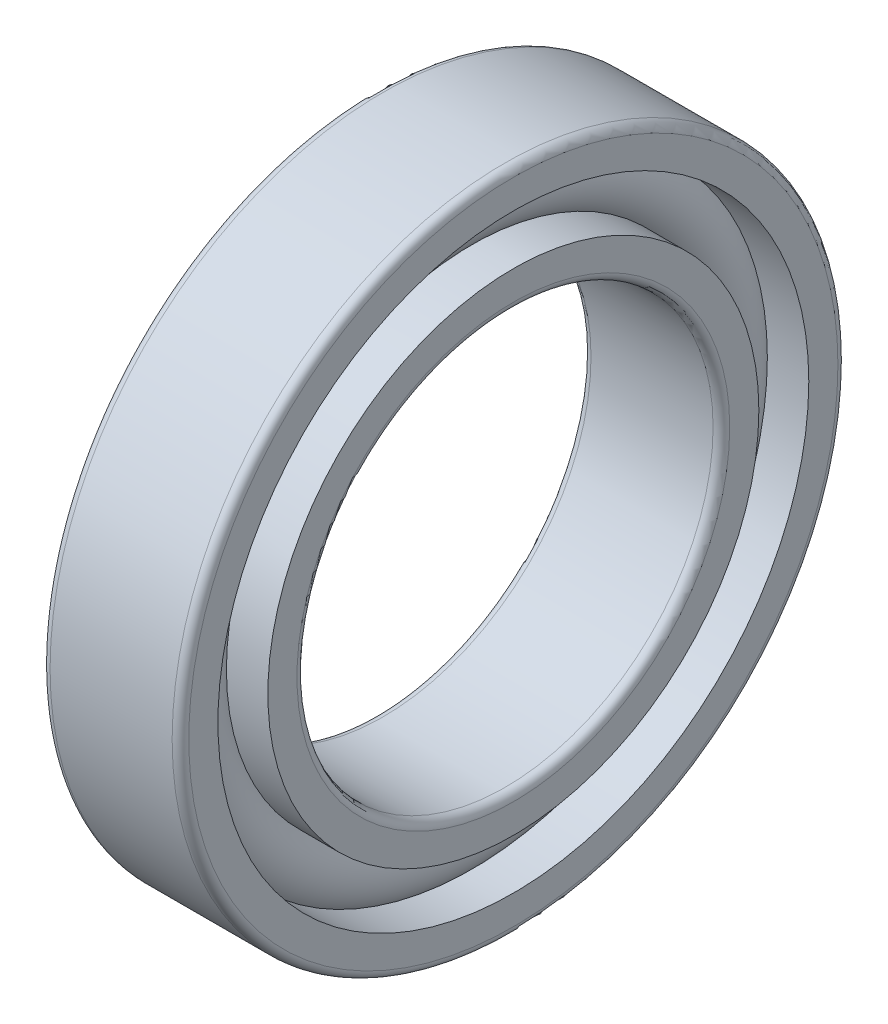
ISO-10303-21;
HEADER;
FILE_DESCRIPTION(('STEP AP214'),'2;1');
FILE_NAME('part.step','',(''),(''),'','','');
FILE_SCHEMA(('AUTOMOTIVE_DESIGN { 1 0 10303 214 1 1 1 1 }'));
ENDSEC;
DATA;
#1=APPLICATION_CONTEXT('core data for automotive mechanical design processes');
#2=APPLICATION_PROTOCOL_DEFINITION('international standard','automotive_design',2000,#1);
#3=PRODUCT_CONTEXT('',#1,'mechanical');
#4=PRODUCT('Part','Part','',(#3));
#5=PRODUCT_RELATED_PRODUCT_CATEGORY('part','',(#4));
#6=PRODUCT_DEFINITION_FORMATION('','',#4);
#7=PRODUCT_DEFINITION_CONTEXT('part definition',#1,'design');
#8=PRODUCT_DEFINITION('design','',#6,#7);
#9=PRODUCT_DEFINITION_SHAPE('','',#8);
#10=(LENGTH_UNIT() NAMED_UNIT(*) SI_UNIT(.MILLI.,.METRE.));
#11=(NAMED_UNIT(*) PLANE_ANGLE_UNIT() SI_UNIT($,.RADIAN.));
#12=(NAMED_UNIT(*) SI_UNIT($,.STERADIAN.) SOLID_ANGLE_UNIT());
#13=UNCERTAINTY_MEASURE_WITH_UNIT(LENGTH_MEASURE(1.E-05),#10,'distance_accuracy_value','');
#14=(GEOMETRIC_REPRESENTATION_CONTEXT(3) GLOBAL_UNCERTAINTY_ASSIGNED_CONTEXT((#13)) GLOBAL_UNIT_ASSIGNED_CONTEXT((#10,
#11,#12)) REPRESENTATION_CONTEXT('',''));
#15=CARTESIAN_POINT('',(0.,0.,0.));
#16=DIRECTION('',(0.,0.,1.));
#17=DIRECTION('',(1.,0.,0.));
#18=AXIS2_PLACEMENT_3D('',#15,#16,#17);
#19=CARTESIAN_POINT('',(0.,0.,0.));
#20=DIRECTION('',(-1.,0.,0.));
#21=DIRECTION('',(0.,0.,1.));
#22=AXIS2_PLACEMENT_3D('',#19,#20,#21);
#23=TOROIDAL_SURFACE('',#22,9.75,1.35);
#24=CARTESIAN_POINT('',(1.0062305898749,0.,0.));
#25=DIRECTION('',(-1.,0.,0.));
#26=DIRECTION('',(0.,0.,1.));
#27=AXIS2_PLACEMENT_3D('',#24,#25,#26);
#28=CIRCLE('',#27,10.65);
#29=CARTESIAN_POINT('',(1.0062305898749,0.,10.65));
#30=VERTEX_POINT('',#29);
#31=EDGE_CURVE('E35',#30,#30,#28,.F.);
#32=ORIENTED_EDGE('',*,*,#31,.T.);
#33=EDGE_LOOP('',(#32));
#34=FACE_BOUND('',#33,.T.);
#35=CARTESIAN_POINT('',(1.0062305898749,0.,0.));
#36=DIRECTION('',(-1.,0.,0.));
#37=DIRECTION('',(0.,0.,1.));
#38=AXIS2_PLACEMENT_3D('',#35,#36,#37);
#39=CIRCLE('',#38,8.85);
#40=CARTESIAN_POINT('',(1.0062305898749,0.,8.85));
#41=VERTEX_POINT('',#40);
#42=EDGE_CURVE('E10',#41,#41,#39,.T.);
#43=ORIENTED_EDGE('',*,*,#42,.T.);
#44=EDGE_LOOP('',(#43));
#45=FACE_BOUND('',#44,.T.);
#46=ADVANCED_FACE('F31',(#34,#45),#23,.T.);
#47=CARTESIAN_POINT('',(-20.6375,0.,0.));
#48=DIRECTION('',(1.,0.,0.));
#49=DIRECTION('',(0.,0.,-1.));
#50=AXIS2_PLACEMENT_3D('',#47,#48,#49);
#51=CYLINDRICAL_SURFACE('',#50,8.85);
#52=CARTESIAN_POINT('',(2.5,0.,0.));
#53=DIRECTION('',(1.,0.,0.));
#54=DIRECTION('',(0.,0.,-1.));
#55=AXIS2_PLACEMENT_3D('',#52,#53,#54);
#56=CIRCLE('',#55,8.85);
#57=CARTESIAN_POINT('',(2.5,0.,-8.85));
#58=VERTEX_POINT('',#57);
#59=EDGE_CURVE('E44',#58,#58,#56,.T.);
#60=ORIENTED_EDGE('',*,*,#59,.F.);
#61=EDGE_LOOP('',(#60));
#62=FACE_BOUND('',#61,.T.);
#63=ORIENTED_EDGE('',*,*,#42,.F.);
#64=EDGE_LOOP('',(#63));
#65=FACE_BOUND('',#64,.T.);
#66=ADVANCED_FACE('F83',(#62,#65),#51,.T.);
#67=CARTESIAN_POINT('',(-20.6375,0.,0.));
#68=DIRECTION('',(1.,0.,0.));
#69=DIRECTION('',(0.,0.,-1.));
#70=AXIS2_PLACEMENT_3D('',#67,#68,#69);
#71=CYLINDRICAL_SURFACE('',#70,8.85);
#72=CARTESIAN_POINT('',(-2.5,0.,0.));
#73=DIRECTION('',(1.,0.,0.));
#74=DIRECTION('',(0.,0.,-1.));
#75=AXIS2_PLACEMENT_3D('',#72,#73,#74);
#76=CIRCLE('',#75,8.85);
#77=CARTESIAN_POINT('',(-2.5,0.,-8.85));
#78=VERTEX_POINT('',#77);
#79=EDGE_CURVE('E53',#78,#78,#76,.T.);
#80=ORIENTED_EDGE('',*,*,#79,.T.);
#81=EDGE_LOOP('',(#80));
#82=FACE_BOUND('',#81,.T.);
#83=CARTESIAN_POINT('',(-1.0062305898749,0.,0.));
#84=DIRECTION('',(1.,0.,0.));
#85=DIRECTION('',(0.,0.,-1.));
#86=AXIS2_PLACEMENT_3D('',#83,#84,#85);
#87=CIRCLE('',#86,8.85);
#88=CARTESIAN_POINT('',(-1.0062305898749,0.,-8.85));
#89=VERTEX_POINT('',#88);
#90=EDGE_CURVE('E39',#89,#89,#87,.T.);
#91=ORIENTED_EDGE('',*,*,#90,.F.);
#92=EDGE_LOOP('',(#91));
#93=FACE_BOUND('',#92,.T.);
#94=ADVANCED_FACE('F86',(#82,#93),#71,.T.);
#95=CARTESIAN_POINT('',(2.5,7.8,0.));
#96=DIRECTION('',(1.,0.,0.));
#97=DIRECTION('',(0.,0.,-1.));
#98=AXIS2_PLACEMENT_3D('',#95,#96,#97);
#99=PLANE('',#98);
#100=ORIENTED_EDGE('',*,*,#59,.T.);
#101=EDGE_LOOP('',(#100));
#102=FACE_BOUND('',#101,.T.);
#103=CARTESIAN_POINT('',(2.5,0.,0.));
#104=DIRECTION('',(1.,0.,0.));
#105=DIRECTION('',(0.,0.,-1.));
#106=AXIS2_PLACEMENT_3D('',#103,#104,#105);
#107=CIRCLE('',#106,7.8);
#108=CARTESIAN_POINT('',(2.5,0.,-7.8));
#109=VERTEX_POINT('',#108);
#110=EDGE_CURVE('E75',#109,#109,#107,.T.);
#111=ORIENTED_EDGE('',*,*,#110,.F.);
#112=EDGE_LOOP('',(#111));
#113=FACE_BOUND('',#112,.T.);
#114=ADVANCED_FACE('F80',(#102,#113),#99,.T.);
#115=CARTESIAN_POINT('',(2.2,0.,0.));
#116=DIRECTION('',(1.,0.,0.));
#117=DIRECTION('',(0.,0.,-1.));
#118=AXIS2_PLACEMENT_3D('',#115,#116,#117);
#119=TOROIDAL_SURFACE('',#118,7.8,0.3);
#120=ORIENTED_EDGE('',*,*,#110,.T.);
#121=EDGE_LOOP('',(#120));
#122=FACE_BOUND('',#121,.T.);
#123=CARTESIAN_POINT('',(2.2,0.,0.));
#124=DIRECTION('',(1.,0.,0.));
#125=DIRECTION('',(0.,0.,-1.));
#126=AXIS2_PLACEMENT_3D('',#123,#124,#125);
#127=CIRCLE('',#126,7.5);
#128=CARTESIAN_POINT('',(2.2,0.,-7.5));
#129=VERTEX_POINT('',#128);
#130=EDGE_CURVE('E72',#129,#129,#127,.T.);
#131=ORIENTED_EDGE('',*,*,#130,.F.);
#132=EDGE_LOOP('',(#131));
#133=FACE_BOUND('',#132,.T.);
#134=ADVANCED_FACE('F97',(#122,#133),#119,.T.);
#135=CARTESIAN_POINT('',(-20.6375,0.,0.));
#136=DIRECTION('',(1.,0.,0.));
#137=DIRECTION('',(0.,0.,-1.));
#138=AXIS2_PLACEMENT_3D('',#135,#136,#137);
#139=CYLINDRICAL_SURFACE('',#138,7.5);
#140=ORIENTED_EDGE('',*,*,#130,.T.);
#141=EDGE_LOOP('',(#140));
#142=FACE_BOUND('',#141,.T.);
#143=CARTESIAN_POINT('',(-2.2,0.,0.));
#144=DIRECTION('',(1.,0.,0.));
#145=DIRECTION('',(0.,0.,-1.));
#146=AXIS2_PLACEMENT_3D('',#143,#144,#145);
#147=CIRCLE('',#146,7.5);
#148=CARTESIAN_POINT('',(-2.2,0.,-7.5));
#149=VERTEX_POINT('',#148);
#150=EDGE_CURVE('E69',#149,#149,#147,.T.);
#151=ORIENTED_EDGE('',*,*,#150,.F.);
#152=EDGE_LOOP('',(#151));
#153=FACE_BOUND('',#152,.T.);
#154=ADVANCED_FACE('F100',(#142,#153),#139,.F.);
#155=CARTESIAN_POINT('',(-2.2,0.,0.));
#156=DIRECTION('',(1.,0.,0.));
#157=DIRECTION('',(0.,0.,-1.));
#158=AXIS2_PLACEMENT_3D('',#155,#156,#157);
#159=TOROIDAL_SURFACE('',#158,7.8,0.3);
#160=ORIENTED_EDGE('',*,*,#150,.T.);
#161=EDGE_LOOP('',(#160));
#162=FACE_BOUND('',#161,.T.);
#163=CARTESIAN_POINT('',(-2.5,0.,0.));
#164=DIRECTION('',(1.,0.,0.));
#165=DIRECTION('',(0.,0.,-1.));
#166=AXIS2_PLACEMENT_3D('',#163,#164,#165);
#167=CIRCLE('',#166,7.8);
#168=CARTESIAN_POINT('',(-2.5,0.,-7.8));
#169=VERTEX_POINT('',#168);
#170=EDGE_CURVE('E66',#169,#169,#167,.T.);
#171=ORIENTED_EDGE('',*,*,#170,.F.);
#172=EDGE_LOOP('',(#171));
#173=FACE_BOUND('',#172,.T.);
#174=ADVANCED_FACE('F104',(#162,#173),#159,.T.);
#175=CARTESIAN_POINT('',(-2.5,8.85,0.));
#176=DIRECTION('',(-1.,0.,0.));
#177=DIRECTION('',(0.,0.,1.));
#178=AXIS2_PLACEMENT_3D('',#175,#176,#177);
#179=PLANE('',#178);
#180=ORIENTED_EDGE('',*,*,#170,.T.);
#181=EDGE_LOOP('',(#180));
#182=FACE_BOUND('',#181,.T.);
#183=ORIENTED_EDGE('',*,*,#79,.F.);
#184=EDGE_LOOP('',(#183));
#185=FACE_BOUND('',#184,.T.);
#186=ADVANCED_FACE('F108',(#182,#185),#179,.T.);
#187=CARTESIAN_POINT('',(-1.0062305898749,0.,0.));
#188=DIRECTION('',(1.,0.,0.));
#189=DIRECTION('',(0.,0.,-1.));
#190=AXIS2_PLACEMENT_3D('',#187,#188,#189);
#191=CIRCLE('',#190,10.65);
#192=CARTESIAN_POINT('',(-1.0062305898749,0.,-10.65));
#193=VERTEX_POINT('',#192);
#194=EDGE_CURVE('E47',#193,#193,#191,.F.);
#195=ORIENTED_EDGE('',*,*,#194,.T.);
#196=EDGE_LOOP('',(#195));
#197=FACE_BOUND('',#196,.T.);
#198=ORIENTED_EDGE('',*,*,#90,.T.);
#199=EDGE_LOOP('',(#198));
#200=FACE_BOUND('',#199,.T.);
#201=ADVANCED_FACE('F33',(#197,#200),#23,.T.);
#202=CARTESIAN_POINT('',(-20.6375,0.,0.));
#203=DIRECTION('',(1.,0.,0.));
#204=DIRECTION('',(0.,0.,-1.));
#205=AXIS2_PLACEMENT_3D('',#202,#203,#204);
#206=CYLINDRICAL_SURFACE('',#205,10.65);
#207=CARTESIAN_POINT('',(2.5,0.,0.));
#208=DIRECTION('',(1.,0.,0.));
#209=DIRECTION('',(0.,0.,-1.));
#210=AXIS2_PLACEMENT_3D('',#207,#208,#209);
#211=CIRCLE('',#210,10.65);
#212=CARTESIAN_POINT('',(2.5,0.,-10.65));
#213=VERTEX_POINT('',#212);
#214=EDGE_CURVE('E49',#213,#213,#211,.T.);
#215=ORIENTED_EDGE('',*,*,#214,.T.);
#216=EDGE_LOOP('',(#215));
#217=FACE_BOUND('',#216,.T.);
#218=ORIENTED_EDGE('',*,*,#31,.F.);
#219=EDGE_LOOP('',(#218));
#220=FACE_BOUND('',#219,.T.);
#221=ADVANCED_FACE('F113',(#217,#220),#206,.F.);
#222=CARTESIAN_POINT('',(-20.6375,0.,0.));
#223=DIRECTION('',(1.,0.,0.));
#224=DIRECTION('',(0.,0.,-1.));
#225=AXIS2_PLACEMENT_3D('',#222,#223,#224);
#226=CYLINDRICAL_SURFACE('',#225,10.65);
#227=CARTESIAN_POINT('',(-2.5,0.,0.));
#228=DIRECTION('',(1.,0.,0.));
#229=DIRECTION('',(0.,0.,-1.));
#230=AXIS2_PLACEMENT_3D('',#227,#228,#229);
#231=CIRCLE('',#230,10.65);
#232=CARTESIAN_POINT('',(-2.5,0.,-10.65));
#233=VERTEX_POINT('',#232);
#234=EDGE_CURVE('E144',#233,#233,#231,.T.);
#235=ORIENTED_EDGE('',*,*,#234,.F.);
#236=EDGE_LOOP('',(#235));
#237=FACE_BOUND('',#236,.T.);
#238=ORIENTED_EDGE('',*,*,#194,.F.);
#239=EDGE_LOOP('',(#238));
#240=FACE_BOUND('',#239,.T.);
#241=ADVANCED_FACE('F116',(#237,#240),#226,.F.);
#242=CARTESIAN_POINT('',(2.5,11.7,0.));
#243=DIRECTION('',(1.,0.,0.));
#244=DIRECTION('',(0.,0.,-1.));
#245=AXIS2_PLACEMENT_3D('',#242,#243,#244);
#246=PLANE('',#245);
#247=CARTESIAN_POINT('',(2.5,0.,0.));
#248=DIRECTION('',(1.,0.,0.));
#249=DIRECTION('',(0.,0.,-1.));
#250=AXIS2_PLACEMENT_3D('',#247,#248,#249);
#251=CIRCLE('',#250,11.7);
#252=CARTESIAN_POINT('',(2.5,0.,-11.7));
#253=VERTEX_POINT('',#252);
#254=EDGE_CURVE('E55',#253,#253,#251,.T.);
#255=ORIENTED_EDGE('',*,*,#254,.T.);
#256=EDGE_LOOP('',(#255));
#257=FACE_BOUND('',#256,.T.);
#258=ORIENTED_EDGE('',*,*,#214,.F.);
#259=EDGE_LOOP('',(#258));
#260=FACE_BOUND('',#259,.T.);
#261=ADVANCED_FACE('F117',(#257,#260),#246,.T.);
#262=CARTESIAN_POINT('',(2.2,0.,0.));
#263=DIRECTION('',(1.,0.,0.));
#264=DIRECTION('',(0.,0.,-1.));
#265=AXIS2_PLACEMENT_3D('',#262,#263,#264);
#266=TOROIDAL_SURFACE('',#265,11.7,0.3);
#267=CARTESIAN_POINT('',(2.2,0.,0.));
#268=DIRECTION('',(1.,0.,0.));
#269=DIRECTION('',(0.,0.,-1.));
#270=AXIS2_PLACEMENT_3D('',#267,#268,#269);
#271=CIRCLE('',#270,12.);
#272=CARTESIAN_POINT('',(2.2,0.,-12.));
#273=VERTEX_POINT('',#272);
#274=EDGE_CURVE('E60',#273,#273,#271,.T.);
#275=ORIENTED_EDGE('',*,*,#274,.T.);
#276=EDGE_LOOP('',(#275));
#277=FACE_BOUND('',#276,.T.);
#278=ORIENTED_EDGE('',*,*,#254,.F.);
#279=EDGE_LOOP('',(#278));
#280=FACE_BOUND('',#279,.T.);
#281=ADVANCED_FACE('F120',(#277,#280),#266,.T.);
#282=CARTESIAN_POINT('',(-20.6375,0.,0.));
#283=DIRECTION('',(1.,0.,0.));
#284=DIRECTION('',(0.,0.,-1.));
#285=AXIS2_PLACEMENT_3D('',#282,#283,#284);
#286=CYLINDRICAL_SURFACE('',#285,12.);
#287=CARTESIAN_POINT('',(-2.2,0.,0.));
#288=DIRECTION('',(1.,0.,0.));
#289=DIRECTION('',(0.,0.,-1.));
#290=AXIS2_PLACEMENT_3D('',#287,#288,#289);
#291=CIRCLE('',#290,12.);
#292=CARTESIAN_POINT('',(-2.2,0.,-12.));
#293=VERTEX_POINT('',#292);
#294=EDGE_CURVE('E148',#293,#293,#291,.T.);
#295=ORIENTED_EDGE('',*,*,#294,.T.);
#296=EDGE_LOOP('',(#295));
#297=FACE_BOUND('',#296,.T.);
#298=ORIENTED_EDGE('',*,*,#274,.F.);
#299=EDGE_LOOP('',(#298));
#300=FACE_BOUND('',#299,.T.);
#301=ADVANCED_FACE('F124',(#297,#300),#286,.T.);
#302=CARTESIAN_POINT('',(-2.2,0.,0.));
#303=DIRECTION('',(1.,0.,0.));
#304=DIRECTION('',(0.,0.,-1.));
#305=AXIS2_PLACEMENT_3D('',#302,#303,#304);
#306=TOROIDAL_SURFACE('',#305,11.7,0.3);
#307=CARTESIAN_POINT('',(-2.5,0.,0.));
#308=DIRECTION('',(1.,0.,0.));
#309=DIRECTION('',(0.,0.,-1.));
#310=AXIS2_PLACEMENT_3D('',#307,#308,#309);
#311=CIRCLE('',#310,11.7);
#312=CARTESIAN_POINT('',(-2.5,0.,-11.7));
#313=VERTEX_POINT('',#312);
#314=EDGE_CURVE('E145',#313,#313,#311,.T.);
#315=ORIENTED_EDGE('',*,*,#314,.T.);
#316=EDGE_LOOP('',(#315));
#317=FACE_BOUND('',#316,.T.);
#318=ORIENTED_EDGE('',*,*,#294,.F.);
#319=EDGE_LOOP('',(#318));
#320=FACE_BOUND('',#319,.T.);
#321=ADVANCED_FACE('F128',(#317,#320),#306,.T.);
#322=CARTESIAN_POINT('',(-2.5,10.65,0.));
#323=DIRECTION('',(-1.,0.,0.));
#324=DIRECTION('',(0.,0.,1.));
#325=AXIS2_PLACEMENT_3D('',#322,#323,#324);
#326=PLANE('',#325);
#327=ORIENTED_EDGE('',*,*,#234,.T.);
#328=EDGE_LOOP('',(#327));
#329=FACE_BOUND('',#328,.T.);
#330=ORIENTED_EDGE('',*,*,#314,.F.);
#331=EDGE_LOOP('',(#330));
#332=FACE_BOUND('',#331,.T.);
#333=ADVANCED_FACE('F132',(#329,#332),#326,.T.);
#334=CLOSED_SHELL('',(#46,#66,#94,#114,#134,#154,#174,#186,#201,#221,#241,#261,#281,#301,#321,#333));
#335=MANIFOLD_SOLID_BREP('B2',#334);
#336=ADVANCED_BREP_SHAPE_REPRESENTATION('',(#18,#335),#14);
#337=SHAPE_DEFINITION_REPRESENTATION(#9,#336);
ENDSEC;
END-ISO-10303-21;
